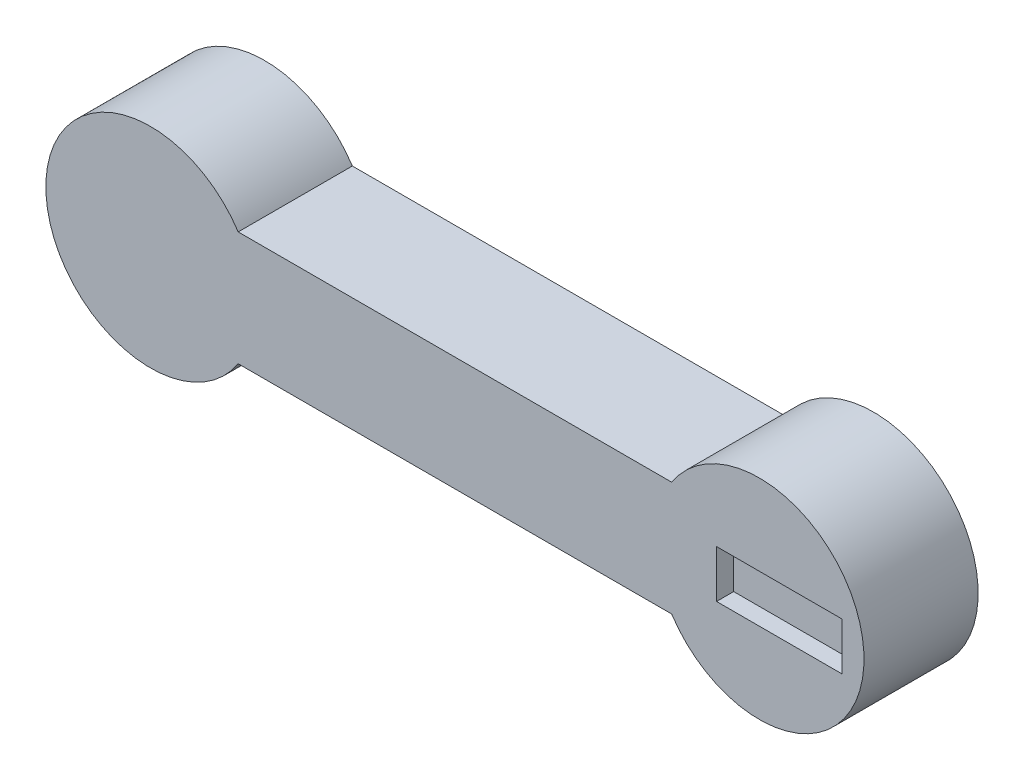
ISO-10303-21;
HEADER;
FILE_DESCRIPTION(('STEP AP214'),'2;1');
FILE_NAME('part.step','',(''),(''),'','','');
FILE_SCHEMA(('AUTOMOTIVE_DESIGN { 1 0 10303 214 1 1 1 1 }'));
ENDSEC;
DATA;
#1=APPLICATION_CONTEXT('core data for automotive mechanical design processes');
#2=APPLICATION_PROTOCOL_DEFINITION('international standard','automotive_design',2000,#1);
#3=PRODUCT_CONTEXT('',#1,'mechanical');
#4=PRODUCT('Part','Part','',(#3));
#5=PRODUCT_RELATED_PRODUCT_CATEGORY('part','',(#4));
#6=PRODUCT_DEFINITION_FORMATION('','',#4);
#7=PRODUCT_DEFINITION_CONTEXT('part definition',#1,'design');
#8=PRODUCT_DEFINITION('design','',#6,#7);
#9=PRODUCT_DEFINITION_SHAPE('','',#8);
#10=(LENGTH_UNIT() NAMED_UNIT(*) SI_UNIT(.MILLI.,.METRE.));
#11=(NAMED_UNIT(*) PLANE_ANGLE_UNIT() SI_UNIT($,.RADIAN.));
#12=(NAMED_UNIT(*) SI_UNIT($,.STERADIAN.) SOLID_ANGLE_UNIT());
#13=UNCERTAINTY_MEASURE_WITH_UNIT(LENGTH_MEASURE(1.E-05),#10,'distance_accuracy_value','');
#14=(GEOMETRIC_REPRESENTATION_CONTEXT(3) GLOBAL_UNCERTAINTY_ASSIGNED_CONTEXT((#13)) GLOBAL_UNIT_ASSIGNED_CONTEXT((#10,
#11,#12)) REPRESENTATION_CONTEXT('',''));
#15=CARTESIAN_POINT('',(0.,0.,0.));
#16=DIRECTION('',(0.,0.,1.));
#17=DIRECTION('',(1.,0.,0.));
#18=AXIS2_PLACEMENT_3D('',#15,#16,#17);
#19=CARTESIAN_POINT('',(0.,0.,30.));
#20=DIRECTION('',(0.,0.,1.));
#21=DIRECTION('',(1.,0.,0.));
#22=AXIS2_PLACEMENT_3D('',#19,#20,#21);
#23=PLANE('',#22);
#24=DIRECTION('',(1.,0.,0.));
#25=VECTOR('',#24,1.);
#26=CARTESIAN_POINT('',(0.,-15.,30.));
#27=LINE('',#26,#25);
#28=CARTESIAN_POINT('',(23.0488611432322,-15.,30.));
#29=VERTEX_POINT('',#28);
#30=CARTESIAN_POINT('',(136.951138856768,-15.,30.));
#31=VERTEX_POINT('',#30);
#32=EDGE_CURVE('E171',#29,#31,#27,.T.);
#33=ORIENTED_EDGE('',*,*,#32,.T.);
#34=CARTESIAN_POINT('',(160.,0.,30.));
#35=DIRECTION('',(0.,0.,1.));
#36=DIRECTION('',(1.,0.,0.));
#37=AXIS2_PLACEMENT_3D('',#34,#35,#36);
#38=CIRCLE('',#37,27.5);
#39=CARTESIAN_POINT('',(136.951138856768,15.,30.));
#40=VERTEX_POINT('',#39);
#41=EDGE_CURVE('E110',#31,#40,#38,.T.);
#42=ORIENTED_EDGE('',*,*,#41,.T.);
#43=DIRECTION('',(1.,0.,0.));
#44=VECTOR('',#43,1.);
#45=CARTESIAN_POINT('',(0.,15.,30.));
#46=LINE('',#45,#44);
#47=CARTESIAN_POINT('',(23.0488611432322,15.,30.));
#48=VERTEX_POINT('',#47);
#49=EDGE_CURVE('E175',#48,#40,#46,.T.);
#50=ORIENTED_EDGE('',*,*,#49,.F.);
#51=CARTESIAN_POINT('',(0.,0.,30.));
#52=DIRECTION('',(0.,0.,1.));
#53=DIRECTION('',(1.,0.,0.));
#54=AXIS2_PLACEMENT_3D('',#51,#52,#53);
#55=CIRCLE('',#54,27.5);
#56=EDGE_CURVE('E181',#48,#29,#55,.T.);
#57=ORIENTED_EDGE('',*,*,#56,.T.);
#58=EDGE_LOOP('',(#33,#42,#50,#57));
#59=FACE_BOUND('',#58,.T.);
#60=DIRECTION('',(0.,-1.,0.));
#61=VECTOR('',#60,1.);
#62=CARTESIAN_POINT('',(148.750000000003,1.98174809895597E-12,30.));
#63=LINE('',#62,#61);
#64=CARTESIAN_POINT('',(148.750000000003,6.24999999999631,30.));
#65=VERTEX_POINT('',#64);
#66=CARTESIAN_POINT('',(148.750000000003,-6.25000000000354,30.));
#67=VERTEX_POINT('',#66);
#68=EDGE_CURVE('E159',#65,#67,#63,.T.);
#69=ORIENTED_EDGE('',*,*,#68,.F.);
#70=DIRECTION('',(1.,0.,0.));
#71=VECTOR('',#70,1.);
#72=CARTESIAN_POINT('',(0.,6.24999999999631,30.));
#73=LINE('',#72,#71);
#74=CARTESIAN_POINT('',(181.750000000003,6.24999999999631,30.));
#75=VERTEX_POINT('',#74);
#76=EDGE_CURVE('E75',#65,#75,#73,.T.);
#77=ORIENTED_EDGE('',*,*,#76,.T.);
#78=DIRECTION('',(0.,-1.,0.));
#79=VECTOR('',#78,1.);
#80=CARTESIAN_POINT('',(181.750000000003,1.61426427780501E-12,30.));
#81=LINE('',#80,#79);
#82=CARTESIAN_POINT('',(181.750000000003,-6.25000000000364,30.));
#83=VERTEX_POINT('',#82);
#84=EDGE_CURVE('E149',#75,#83,#81,.T.);
#85=ORIENTED_EDGE('',*,*,#84,.T.);
#86=DIRECTION('',(1.,0.,0.));
#87=VECTOR('',#86,1.);
#88=CARTESIAN_POINT('',(0.,-6.25000000000307,30.));
#89=LINE('',#88,#87);
#90=EDGE_CURVE('E161',#67,#83,#89,.T.);
#91=ORIENTED_EDGE('',*,*,#90,.F.);
#92=EDGE_LOOP('',(#69,#77,#85,#91));
#93=FACE_BOUND('',#92,.T.);
#94=ADVANCED_FACE('F58',(#59,#93),#23,.T.);
#95=CARTESIAN_POINT('',(160.,0.,30.));
#96=DIRECTION('',(0.,0.,-1.));
#97=DIRECTION('',(-1.,0.,0.));
#98=AXIS2_PLACEMENT_3D('',#95,#96,#97);
#99=CYLINDRICAL_SURFACE('',#98,27.5);
#100=CARTESIAN_POINT('',(160.,0.,0.));
#101=DIRECTION('',(0.,0.,1.));
#102=DIRECTION('',(1.,0.,0.));
#103=AXIS2_PLACEMENT_3D('',#100,#101,#102);
#104=CIRCLE('',#103,27.5);
#105=CARTESIAN_POINT('',(136.951138856768,-15.,0.));
#106=VERTEX_POINT('',#105);
#107=CARTESIAN_POINT('',(136.951138856768,15.,0.));
#108=VERTEX_POINT('',#107);
#109=EDGE_CURVE('E180',#106,#108,#104,.T.);
#110=ORIENTED_EDGE('',*,*,#109,.T.);
#111=DIRECTION('',(0.,0.,-1.));
#112=VECTOR('',#111,1.);
#113=CARTESIAN_POINT('',(136.951138856768,15.,30.));
#114=LINE('',#113,#112);
#115=EDGE_CURVE('E67',#40,#108,#114,.T.);
#116=ORIENTED_EDGE('',*,*,#115,.F.);
#117=ORIENTED_EDGE('',*,*,#41,.F.);
#118=DIRECTION('',(0.,0.,-1.));
#119=VECTOR('',#118,1.);
#120=CARTESIAN_POINT('',(136.951138856768,-15.,30.));
#121=LINE('',#120,#119);
#122=EDGE_CURVE('E12',#31,#106,#121,.T.);
#123=ORIENTED_EDGE('',*,*,#122,.T.);
#124=EDGE_LOOP('',(#110,#116,#117,#123));
#125=FACE_BOUND('',#124,.T.);
#126=ADVANCED_FACE('F198',(#125),#99,.T.);
#127=CARTESIAN_POINT('',(0.,15.,30.));
#128=DIRECTION('',(0.,1.,0.));
#129=DIRECTION('',(0.,0.,1.));
#130=AXIS2_PLACEMENT_3D('',#127,#128,#129);
#131=PLANE('',#130);
#132=DIRECTION('',(1.,0.,0.));
#133=VECTOR('',#132,1.);
#134=CARTESIAN_POINT('',(0.,15.,0.));
#135=LINE('',#134,#133);
#136=CARTESIAN_POINT('',(23.0488611432322,15.,0.));
#137=VERTEX_POINT('',#136);
#138=EDGE_CURVE('E173',#137,#108,#135,.T.);
#139=ORIENTED_EDGE('',*,*,#138,.F.);
#140=DIRECTION('',(0.,0.,-1.));
#141=VECTOR('',#140,1.);
#142=CARTESIAN_POINT('',(23.0488611432322,15.,30.));
#143=LINE('',#142,#141);
#144=EDGE_CURVE('E187',#48,#137,#143,.T.);
#145=ORIENTED_EDGE('',*,*,#144,.F.);
#146=ORIENTED_EDGE('',*,*,#49,.T.);
#147=ORIENTED_EDGE('',*,*,#115,.T.);
#148=EDGE_LOOP('',(#139,#145,#146,#147));
#149=FACE_BOUND('',#148,.T.);
#150=ADVANCED_FACE('F200',(#149),#131,.T.);
#151=CARTESIAN_POINT('',(0.,-15.,30.));
#152=DIRECTION('',(0.,1.,0.));
#153=DIRECTION('',(-1.,0.,0.));
#154=AXIS2_PLACEMENT_3D('',#151,#152,#153);
#155=PLANE('',#154);
#156=DIRECTION('',(1.,0.,0.));
#157=VECTOR('',#156,1.);
#158=CARTESIAN_POINT('',(0.,-15.,0.));
#159=LINE('',#158,#157);
#160=CARTESIAN_POINT('',(23.0488611432322,-15.,0.));
#161=VERTEX_POINT('',#160);
#162=EDGE_CURVE('E178',#161,#106,#159,.T.);
#163=ORIENTED_EDGE('',*,*,#162,.T.);
#164=ORIENTED_EDGE('',*,*,#122,.F.);
#165=ORIENTED_EDGE('',*,*,#32,.F.);
#166=DIRECTION('',(0.,0.,-1.));
#167=VECTOR('',#166,1.);
#168=CARTESIAN_POINT('',(23.0488611432322,-15.,30.));
#169=LINE('',#168,#167);
#170=EDGE_CURVE('E84',#29,#161,#169,.T.);
#171=ORIENTED_EDGE('',*,*,#170,.T.);
#172=EDGE_LOOP('',(#163,#164,#165,#171));
#173=FACE_BOUND('',#172,.T.);
#174=ADVANCED_FACE('F197',(#173),#155,.F.);
#175=CARTESIAN_POINT('',(0.,0.,0.));
#176=DIRECTION('',(0.,0.,1.));
#177=DIRECTION('',(1.,0.,0.));
#178=AXIS2_PLACEMENT_3D('',#175,#176,#177);
#179=PLANE('',#178);
#180=ORIENTED_EDGE('',*,*,#162,.F.);
#181=CARTESIAN_POINT('',(0.,0.,0.));
#182=DIRECTION('',(0.,0.,1.));
#183=DIRECTION('',(1.,0.,0.));
#184=AXIS2_PLACEMENT_3D('',#181,#182,#183);
#185=CIRCLE('',#184,27.5);
#186=EDGE_CURVE('E62',#137,#161,#185,.T.);
#187=ORIENTED_EDGE('',*,*,#186,.F.);
#188=ORIENTED_EDGE('',*,*,#138,.T.);
#189=ORIENTED_EDGE('',*,*,#109,.F.);
#190=EDGE_LOOP('',(#180,#187,#188,#189));
#191=FACE_BOUND('',#190,.T.);
#192=ADVANCED_FACE('F195',(#191),#179,.F.);
#193=CARTESIAN_POINT('',(0.,0.,30.));
#194=DIRECTION('',(0.,0.,-1.));
#195=DIRECTION('',(-1.,0.,0.));
#196=AXIS2_PLACEMENT_3D('',#193,#194,#195);
#197=CYLINDRICAL_SURFACE('',#196,27.5);
#198=ORIENTED_EDGE('',*,*,#186,.T.);
#199=ORIENTED_EDGE('',*,*,#170,.F.);
#200=ORIENTED_EDGE('',*,*,#56,.F.);
#201=ORIENTED_EDGE('',*,*,#144,.T.);
#202=EDGE_LOOP('',(#198,#199,#200,#201));
#203=FACE_BOUND('',#202,.T.);
#204=ADVANCED_FACE('F60',(#203),#197,.T.);
#205=CARTESIAN_POINT('',(0.,6.24999999999631,25.5));
#206=DIRECTION('',(0.,-1.,0.));
#207=DIRECTION('',(0.,0.,-1.));
#208=AXIS2_PLACEMENT_3D('',#205,#206,#207);
#209=PLANE('',#208);
#210=ORIENTED_EDGE('',*,*,#76,.F.);
#211=DIRECTION('',(0.,0.,1.));
#212=VECTOR('',#211,1.);
#213=CARTESIAN_POINT('',(148.750000000003,6.24999999999631,25.5));
#214=LINE('',#213,#212);
#215=CARTESIAN_POINT('',(148.750000000003,6.24999999999631,25.5));
#216=VERTEX_POINT('',#215);
#217=EDGE_CURVE('E132',#216,#65,#214,.T.);
#218=ORIENTED_EDGE('',*,*,#217,.F.);
#219=DIRECTION('',(1.,0.,0.));
#220=VECTOR('',#219,1.);
#221=CARTESIAN_POINT('',(0.,6.24999999999631,25.5));
#222=LINE('',#221,#220);
#223=CARTESIAN_POINT('',(181.750000000003,6.24999999999631,25.5));
#224=VERTEX_POINT('',#223);
#225=EDGE_CURVE('E135',#216,#224,#222,.T.);
#226=ORIENTED_EDGE('',*,*,#225,.T.);
#227=DIRECTION('',(0.,0.,1.));
#228=VECTOR('',#227,1.);
#229=CARTESIAN_POINT('',(181.750000000003,6.24999999999631,25.5));
#230=LINE('',#229,#228);
#231=EDGE_CURVE('E166',#224,#75,#230,.T.);
#232=ORIENTED_EDGE('',*,*,#231,.T.);
#233=EDGE_LOOP('',(#210,#218,#226,#232));
#234=FACE_BOUND('',#233,.T.);
#235=ADVANCED_FACE('F134',(#234),#209,.T.);
#236=CARTESIAN_POINT('',(181.750000000003,1.61426427780501E-12,25.5));
#237=DIRECTION('',(-1.,0.,0.));
#238=DIRECTION('',(0.,-1.,0.));
#239=AXIS2_PLACEMENT_3D('',#236,#237,#238);
#240=PLANE('',#239);
#241=ORIENTED_EDGE('',*,*,#84,.F.);
#242=ORIENTED_EDGE('',*,*,#231,.F.);
#243=DIRECTION('',(0.,-1.,0.));
#244=VECTOR('',#243,1.);
#245=CARTESIAN_POINT('',(181.750000000003,1.61426427780501E-12,25.5));
#246=LINE('',#245,#244);
#247=CARTESIAN_POINT('',(181.750000000003,-6.25000000000364,25.5));
#248=VERTEX_POINT('',#247);
#249=EDGE_CURVE('E142',#224,#248,#246,.T.);
#250=ORIENTED_EDGE('',*,*,#249,.T.);
#251=DIRECTION('',(0.,0.,1.));
#252=VECTOR('',#251,1.);
#253=CARTESIAN_POINT('',(181.750000000003,-6.25000000000364,25.5));
#254=LINE('',#253,#252);
#255=EDGE_CURVE('E168',#248,#83,#254,.T.);
#256=ORIENTED_EDGE('',*,*,#255,.T.);
#257=EDGE_LOOP('',(#241,#242,#250,#256));
#258=FACE_BOUND('',#257,.T.);
#259=ADVANCED_FACE('F209',(#258),#240,.T.);
#260=CARTESIAN_POINT('',(0.,-6.25000000000307,25.5));
#261=DIRECTION('',(0.,-1.,0.));
#262=DIRECTION('',(1.,0.,0.));
#263=AXIS2_PLACEMENT_3D('',#260,#261,#262);
#264=PLANE('',#263);
#265=ORIENTED_EDGE('',*,*,#90,.T.);
#266=ORIENTED_EDGE('',*,*,#255,.F.);
#267=DIRECTION('',(1.,0.,0.));
#268=VECTOR('',#267,1.);
#269=CARTESIAN_POINT('',(0.,-6.25000000000307,25.5));
#270=LINE('',#269,#268);
#271=CARTESIAN_POINT('',(148.750000000003,-6.25000000000354,25.5));
#272=VERTEX_POINT('',#271);
#273=EDGE_CURVE('E153',#272,#248,#270,.T.);
#274=ORIENTED_EDGE('',*,*,#273,.F.);
#275=DIRECTION('',(0.,0.,1.));
#276=VECTOR('',#275,1.);
#277=CARTESIAN_POINT('',(148.750000000003,-6.25000000000354,25.5));
#278=LINE('',#277,#276);
#279=EDGE_CURVE('E141',#272,#67,#278,.T.);
#280=ORIENTED_EDGE('',*,*,#279,.T.);
#281=EDGE_LOOP('',(#265,#266,#274,#280));
#282=FACE_BOUND('',#281,.T.);
#283=ADVANCED_FACE('F207',(#282),#264,.F.);
#284=CARTESIAN_POINT('',(148.750000000003,1.98174809895597E-12,25.5));
#285=DIRECTION('',(-1.,0.,0.));
#286=DIRECTION('',(0.,-1.,0.));
#287=AXIS2_PLACEMENT_3D('',#284,#285,#286);
#288=PLANE('',#287);
#289=ORIENTED_EDGE('',*,*,#68,.T.);
#290=ORIENTED_EDGE('',*,*,#279,.F.);
#291=DIRECTION('',(0.,-1.,0.));
#292=VECTOR('',#291,1.);
#293=CARTESIAN_POINT('',(148.750000000003,1.98174809895597E-12,25.5));
#294=LINE('',#293,#292);
#295=EDGE_CURVE('E148',#216,#272,#294,.T.);
#296=ORIENTED_EDGE('',*,*,#295,.F.);
#297=ORIENTED_EDGE('',*,*,#217,.T.);
#298=EDGE_LOOP('',(#289,#290,#296,#297));
#299=FACE_BOUND('',#298,.T.);
#300=ADVANCED_FACE('F151',(#299),#288,.F.);
#301=CARTESIAN_POINT('',(0.,0.,25.5));
#302=DIRECTION('',(0.,0.,1.));
#303=DIRECTION('',(1.,0.,0.));
#304=AXIS2_PLACEMENT_3D('',#301,#302,#303);
#305=PLANE('',#304);
#306=ORIENTED_EDGE('',*,*,#225,.F.);
#307=ORIENTED_EDGE('',*,*,#295,.T.);
#308=ORIENTED_EDGE('',*,*,#273,.T.);
#309=ORIENTED_EDGE('',*,*,#249,.F.);
#310=EDGE_LOOP('',(#306,#307,#308,#309));
#311=FACE_BOUND('',#310,.T.);
#312=ADVANCED_FACE('F146',(#311),#305,.T.);
#313=CLOSED_SHELL('',(#94,#126,#150,#174,#192,#204,#235,#259,#283,#300,#312));
#314=MANIFOLD_SOLID_BREP('B2',#313);
#315=ADVANCED_BREP_SHAPE_REPRESENTATION('',(#18,#314),#14);
#316=SHAPE_DEFINITION_REPRESENTATION(#9,#315);
ENDSEC;
END-ISO-10303-21;
